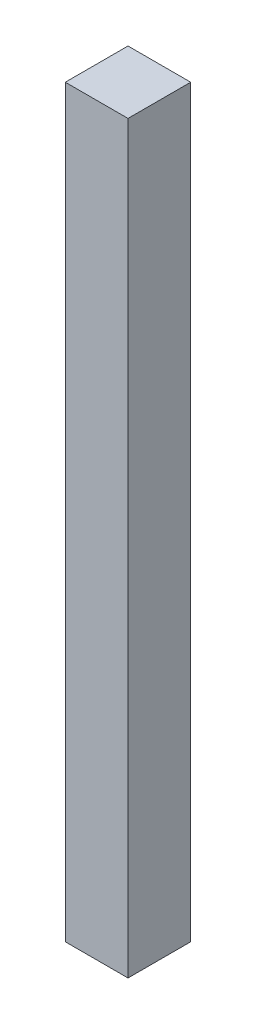
ISO-10303-21;
HEADER;
FILE_DESCRIPTION(('STEP AP214'),'2;1');
FILE_NAME('part.step','',(''),(''),'','','');
FILE_SCHEMA(('AUTOMOTIVE_DESIGN { 1 0 10303 214 1 1 1 1 }'));
ENDSEC;
DATA;
#1=APPLICATION_CONTEXT('core data for automotive mechanical design processes');
#2=APPLICATION_PROTOCOL_DEFINITION('international standard','automotive_design',2000,#1);
#3=PRODUCT_CONTEXT('',#1,'mechanical');
#4=PRODUCT('Part','Part','',(#3));
#5=PRODUCT_RELATED_PRODUCT_CATEGORY('part','',(#4));
#6=PRODUCT_DEFINITION_FORMATION('','',#4);
#7=PRODUCT_DEFINITION_CONTEXT('part definition',#1,'design');
#8=PRODUCT_DEFINITION('design','',#6,#7);
#9=PRODUCT_DEFINITION_SHAPE('','',#8);
#10=(LENGTH_UNIT() NAMED_UNIT(*) SI_UNIT(.MILLI.,.METRE.));
#11=(NAMED_UNIT(*) PLANE_ANGLE_UNIT() SI_UNIT($,.RADIAN.));
#12=(NAMED_UNIT(*) SI_UNIT($,.STERADIAN.) SOLID_ANGLE_UNIT());
#13=UNCERTAINTY_MEASURE_WITH_UNIT(LENGTH_MEASURE(1.E-05),#10,'distance_accuracy_value','');
#14=(GEOMETRIC_REPRESENTATION_CONTEXT(3) GLOBAL_UNCERTAINTY_ASSIGNED_CONTEXT((#13)) GLOBAL_UNIT_ASSIGNED_CONTEXT((#10,
#11,#12)) REPRESENTATION_CONTEXT('',''));
#15=CARTESIAN_POINT('',(0.,0.,0.));
#16=DIRECTION('',(0.,0.,1.));
#17=DIRECTION('',(1.,0.,0.));
#18=AXIS2_PLACEMENT_3D('',#15,#16,#17);
#19=CARTESIAN_POINT('',(0.,241.,0.));
#20=DIRECTION('',(1.,0.,0.));
#21=DIRECTION('',(0.,0.,-1.));
#22=AXIS2_PLACEMENT_3D('',#19,#20,#21);
#23=PLANE('',#22);
#24=DIRECTION('',(0.,0.,1.));
#25=VECTOR('',#24,1.);
#26=CARTESIAN_POINT('',(0.,0.,0.));
#27=LINE('',#26,#25);
#28=CARTESIAN_POINT('',(0.,0.,-20.3));
#29=VERTEX_POINT('',#28);
#30=CARTESIAN_POINT('',(0.,0.,0.));
#31=VERTEX_POINT('',#30);
#32=EDGE_CURVE('E107',#29,#31,#27,.T.);
#33=ORIENTED_EDGE('',*,*,#32,.T.);
#34=DIRECTION('',(0.,-1.,0.));
#35=VECTOR('',#34,1.);
#36=CARTESIAN_POINT('',(0.,241.,0.));
#37=LINE('',#36,#35);
#38=CARTESIAN_POINT('',(0.,241.,0.));
#39=VERTEX_POINT('',#38);
#40=EDGE_CURVE('E11',#39,#31,#37,.T.);
#41=ORIENTED_EDGE('',*,*,#40,.F.);
#42=DIRECTION('',(0.,0.,1.));
#43=VECTOR('',#42,1.);
#44=CARTESIAN_POINT('',(0.,241.,0.));
#45=LINE('',#44,#43);
#46=CARTESIAN_POINT('',(0.,241.,-20.3));
#47=VERTEX_POINT('',#46);
#48=EDGE_CURVE('E91',#47,#39,#45,.T.);
#49=ORIENTED_EDGE('',*,*,#48,.F.);
#50=DIRECTION('',(0.,-1.,0.));
#51=VECTOR('',#50,1.);
#52=CARTESIAN_POINT('',(0.,241.,-20.3));
#53=LINE('',#52,#51);
#54=EDGE_CURVE('E103',#47,#29,#53,.T.);
#55=ORIENTED_EDGE('',*,*,#54,.T.);
#56=EDGE_LOOP('',(#33,#41,#49,#55));
#57=FACE_BOUND('',#56,.T.);
#58=ADVANCED_FACE('F39',(#57),#23,.F.);
#59=CARTESIAN_POINT('',(0.,241.,0.));
#60=DIRECTION('',(0.,0.,-1.));
#61=DIRECTION('',(-1.,0.,0.));
#62=AXIS2_PLACEMENT_3D('',#59,#60,#61);
#63=PLANE('',#62);
#64=DIRECTION('',(1.,0.,0.));
#65=VECTOR('',#64,1.);
#66=CARTESIAN_POINT('',(0.,0.,0.));
#67=LINE('',#66,#65);
#68=CARTESIAN_POINT('',(20.3,0.,0.));
#69=VERTEX_POINT('',#68);
#70=EDGE_CURVE('E96',#31,#69,#67,.T.);
#71=ORIENTED_EDGE('',*,*,#70,.T.);
#72=DIRECTION('',(0.,-1.,0.));
#73=VECTOR('',#72,1.);
#74=CARTESIAN_POINT('',(20.3,241.,0.));
#75=LINE('',#74,#73);
#76=CARTESIAN_POINT('',(20.3,241.,0.));
#77=VERTEX_POINT('',#76);
#78=EDGE_CURVE('E48',#77,#69,#75,.T.);
#79=ORIENTED_EDGE('',*,*,#78,.F.);
#80=DIRECTION('',(1.,0.,0.));
#81=VECTOR('',#80,1.);
#82=CARTESIAN_POINT('',(0.,241.,0.));
#83=LINE('',#82,#81);
#84=EDGE_CURVE('E86',#39,#77,#83,.T.);
#85=ORIENTED_EDGE('',*,*,#84,.F.);
#86=ORIENTED_EDGE('',*,*,#40,.T.);
#87=EDGE_LOOP('',(#71,#79,#85,#86));
#88=FACE_BOUND('',#87,.T.);
#89=ADVANCED_FACE('F95',(#88),#63,.F.);
#90=CARTESIAN_POINT('',(20.3,241.,0.));
#91=DIRECTION('',(-1.,0.,0.));
#92=DIRECTION('',(0.,0.,1.));
#93=AXIS2_PLACEMENT_3D('',#90,#91,#92);
#94=PLANE('',#93);
#95=DIRECTION('',(0.,0.,-1.));
#96=VECTOR('',#95,1.);
#97=CARTESIAN_POINT('',(20.3,0.,0.));
#98=LINE('',#97,#96);
#99=CARTESIAN_POINT('',(20.3,0.,-20.3));
#100=VERTEX_POINT('',#99);
#101=EDGE_CURVE('E73',#69,#100,#98,.T.);
#102=ORIENTED_EDGE('',*,*,#101,.T.);
#103=DIRECTION('',(0.,-1.,0.));
#104=VECTOR('',#103,1.);
#105=CARTESIAN_POINT('',(20.3,241.,-20.3));
#106=LINE('',#105,#104);
#107=CARTESIAN_POINT('',(20.3,241.,-20.3));
#108=VERTEX_POINT('',#107);
#109=EDGE_CURVE('E98',#108,#100,#106,.T.);
#110=ORIENTED_EDGE('',*,*,#109,.F.);
#111=DIRECTION('',(0.,0.,-1.));
#112=VECTOR('',#111,1.);
#113=CARTESIAN_POINT('',(20.3,241.,0.));
#114=LINE('',#113,#112);
#115=EDGE_CURVE('E89',#77,#108,#114,.T.);
#116=ORIENTED_EDGE('',*,*,#115,.F.);
#117=ORIENTED_EDGE('',*,*,#78,.T.);
#118=EDGE_LOOP('',(#102,#110,#116,#117));
#119=FACE_BOUND('',#118,.T.);
#120=ADVANCED_FACE('F99',(#119),#94,.F.);
#121=CARTESIAN_POINT('',(0.,241.,-20.3));
#122=DIRECTION('',(0.,0.,1.));
#123=DIRECTION('',(1.,0.,0.));
#124=AXIS2_PLACEMENT_3D('',#121,#122,#123);
#125=PLANE('',#124);
#126=DIRECTION('',(-1.,0.,0.));
#127=VECTOR('',#126,1.);
#128=CARTESIAN_POINT('',(0.,0.,-20.3));
#129=LINE('',#128,#127);
#130=EDGE_CURVE('E79',#100,#29,#129,.T.);
#131=ORIENTED_EDGE('',*,*,#130,.T.);
#132=ORIENTED_EDGE('',*,*,#54,.F.);
#133=DIRECTION('',(-1.,0.,0.));
#134=VECTOR('',#133,1.);
#135=CARTESIAN_POINT('',(0.,241.,-20.3));
#136=LINE('',#135,#134);
#137=EDGE_CURVE('E56',#108,#47,#136,.T.);
#138=ORIENTED_EDGE('',*,*,#137,.F.);
#139=ORIENTED_EDGE('',*,*,#109,.T.);
#140=EDGE_LOOP('',(#131,#132,#138,#139));
#141=FACE_BOUND('',#140,.T.);
#142=ADVANCED_FACE('F120',(#141),#125,.F.);
#143=CARTESIAN_POINT('',(0.,241.,0.));
#144=DIRECTION('',(0.,-1.,0.));
#145=DIRECTION('',(0.,0.,-1.));
#146=AXIS2_PLACEMENT_3D('',#143,#144,#145);
#147=PLANE('',#146);
#148=ORIENTED_EDGE('',*,*,#48,.T.);
#149=ORIENTED_EDGE('',*,*,#84,.T.);
#150=ORIENTED_EDGE('',*,*,#115,.T.);
#151=ORIENTED_EDGE('',*,*,#137,.T.);
#152=EDGE_LOOP('',(#148,#149,#150,#151));
#153=FACE_BOUND('',#152,.T.);
#154=ADVANCED_FACE('F87',(#153),#147,.F.);
#155=CARTESIAN_POINT('',(0.,0.,0.));
#156=DIRECTION('',(0.,-1.,0.));
#157=DIRECTION('',(0.,0.,-1.));
#158=AXIS2_PLACEMENT_3D('',#155,#156,#157);
#159=PLANE('',#158);
#160=ORIENTED_EDGE('',*,*,#32,.F.);
#161=ORIENTED_EDGE('',*,*,#130,.F.);
#162=ORIENTED_EDGE('',*,*,#101,.F.);
#163=ORIENTED_EDGE('',*,*,#70,.F.);
#164=EDGE_LOOP('',(#160,#161,#162,#163));
#165=FACE_BOUND('',#164,.T.);
#166=ADVANCED_FACE('F123',(#165),#159,.T.);
#167=CLOSED_SHELL('',(#58,#89,#120,#142,#154,#166));
#168=MANIFOLD_SOLID_BREP('B2',#167);
#169=ADVANCED_BREP_SHAPE_REPRESENTATION('',(#18,#168),#14);
#170=SHAPE_DEFINITION_REPRESENTATION(#9,#169);
ENDSEC;
END-ISO-10303-21;
